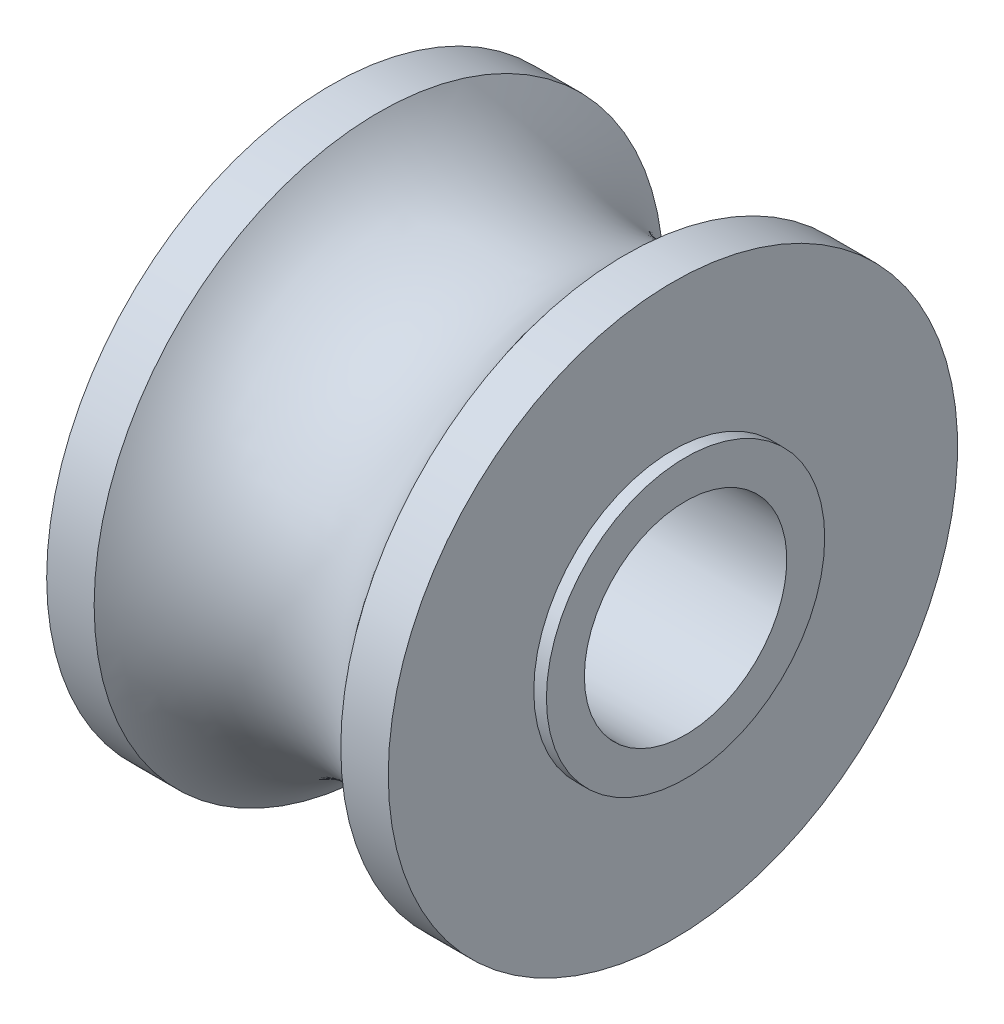
ISO-10303-21;
HEADER;
FILE_DESCRIPTION(('STEP AP214'),'2;1');
FILE_NAME('part.step','',(''),(''),'','','');
FILE_SCHEMA(('AUTOMOTIVE_DESIGN { 1 0 10303 214 1 1 1 1 }'));
ENDSEC;
DATA;
#1=APPLICATION_CONTEXT('core data for automotive mechanical design processes');
#2=APPLICATION_PROTOCOL_DEFINITION('international standard','automotive_design',2000,#1);
#3=PRODUCT_CONTEXT('',#1,'mechanical');
#4=PRODUCT('Part','Part','',(#3));
#5=PRODUCT_RELATED_PRODUCT_CATEGORY('part','',(#4));
#6=PRODUCT_DEFINITION_FORMATION('','',#4);
#7=PRODUCT_DEFINITION_CONTEXT('part definition',#1,'design');
#8=PRODUCT_DEFINITION('design','',#6,#7);
#9=PRODUCT_DEFINITION_SHAPE('','',#8);
#10=(LENGTH_UNIT() NAMED_UNIT(*) SI_UNIT(.MILLI.,.METRE.));
#11=(NAMED_UNIT(*) PLANE_ANGLE_UNIT() SI_UNIT($,.RADIAN.));
#12=(NAMED_UNIT(*) SI_UNIT($,.STERADIAN.) SOLID_ANGLE_UNIT());
#13=UNCERTAINTY_MEASURE_WITH_UNIT(LENGTH_MEASURE(1.E-05),#10,'distance_accuracy_value','');
#14=(GEOMETRIC_REPRESENTATION_CONTEXT(3) GLOBAL_UNCERTAINTY_ASSIGNED_CONTEXT((#13)) GLOBAL_UNIT_ASSIGNED_CONTEXT((#10,
#11,#12)) REPRESENTATION_CONTEXT('',''));
#15=CARTESIAN_POINT('',(0.,0.,0.));
#16=DIRECTION('',(0.,0.,1.));
#17=DIRECTION('',(1.,0.,0.));
#18=AXIS2_PLACEMENT_3D('',#15,#16,#17);
#19=CARTESIAN_POINT('',(0.,0.,0.));
#20=DIRECTION('',(-1.,0.,0.));
#21=DIRECTION('',(0.,0.,1.));
#22=AXIS2_PLACEMENT_3D('',#19,#20,#21);
#23=TOROIDAL_SURFACE('',#22,14.75,6.);
#24=CARTESIAN_POINT('',(4.87339717240448,0.,0.));
#25=DIRECTION('',(-1.,0.,0.));
#26=DIRECTION('',(0.,0.,1.));
#27=AXIS2_PLACEMENT_3D('',#24,#25,#26);
#28=CIRCLE('',#27,11.25);
#29=CARTESIAN_POINT('',(4.87339717240448,0.,11.25));
#30=VERTEX_POINT('',#29);
#31=EDGE_CURVE('E67',#30,#30,#28,.T.);
#32=ORIENTED_EDGE('',*,*,#31,.T.);
#33=EDGE_LOOP('',(#32));
#34=FACE_BOUND('',#33,.T.);
#35=CARTESIAN_POINT('',(-4.87339717240448,0.,0.));
#36=DIRECTION('',(-1.,0.,0.));
#37=DIRECTION('',(0.,0.,1.));
#38=AXIS2_PLACEMENT_3D('',#35,#36,#37);
#39=CIRCLE('',#38,11.25);
#40=CARTESIAN_POINT('',(-4.87339717240448,0.,11.25));
#41=VERTEX_POINT('',#40);
#42=EDGE_CURVE('E10',#41,#41,#39,.T.);
#43=ORIENTED_EDGE('',*,*,#42,.F.);
#44=EDGE_LOOP('',(#43));
#45=FACE_BOUND('',#44,.T.);
#46=ADVANCED_FACE('F33',(#34,#45),#23,.F.);
#47=CARTESIAN_POINT('',(-7.25,0.,0.));
#48=DIRECTION('',(-1.,0.,0.));
#49=DIRECTION('',(0.,0.,1.));
#50=AXIS2_PLACEMENT_3D('',#47,#48,#49);
#51=CYLINDRICAL_SURFACE('',#50,11.25);
#52=ORIENTED_EDGE('',*,*,#42,.T.);
#53=EDGE_LOOP('',(#52));
#54=FACE_BOUND('',#53,.T.);
#55=CARTESIAN_POINT('',(-6.75,0.,0.));
#56=DIRECTION('',(-1.,0.,0.));
#57=DIRECTION('',(0.,0.,1.));
#58=AXIS2_PLACEMENT_3D('',#55,#56,#57);
#59=CIRCLE('',#58,11.25);
#60=CARTESIAN_POINT('',(-6.75,0.,11.25));
#61=VERTEX_POINT('',#60);
#62=EDGE_CURVE('E39',#61,#61,#59,.T.);
#63=ORIENTED_EDGE('',*,*,#62,.F.);
#64=EDGE_LOOP('',(#63));
#65=FACE_BOUND('',#64,.T.);
#66=ADVANCED_FACE('F85',(#54,#65),#51,.T.);
#67=CARTESIAN_POINT('',(-6.75,0.,0.));
#68=DIRECTION('',(-1.,0.,0.));
#69=DIRECTION('',(0.,0.,1.));
#70=AXIS2_PLACEMENT_3D('',#67,#68,#69);
#71=PLANE('',#70);
#72=ORIENTED_EDGE('',*,*,#62,.T.);
#73=EDGE_LOOP('',(#72));
#74=FACE_BOUND('',#73,.T.);
#75=CARTESIAN_POINT('',(-6.75,0.,0.));
#76=DIRECTION('',(-1.,0.,0.));
#77=DIRECTION('',(0.,0.,1.));
#78=AXIS2_PLACEMENT_3D('',#75,#76,#77);
#79=CIRCLE('',#78,5.5);
#80=CARTESIAN_POINT('',(-6.75,0.,5.5));
#81=VERTEX_POINT('',#80);
#82=EDGE_CURVE('E43',#81,#81,#79,.T.);
#83=ORIENTED_EDGE('',*,*,#82,.F.);
#84=EDGE_LOOP('',(#83));
#85=FACE_BOUND('',#84,.T.);
#86=ADVANCED_FACE('F89',(#74,#85),#71,.T.);
#87=CARTESIAN_POINT('',(-7.25,0.,0.));
#88=DIRECTION('',(-1.,0.,0.));
#89=DIRECTION('',(0.,0.,1.));
#90=AXIS2_PLACEMENT_3D('',#87,#88,#89);
#91=CYLINDRICAL_SURFACE('',#90,5.5);
#92=ORIENTED_EDGE('',*,*,#82,.T.);
#93=EDGE_LOOP('',(#92));
#94=FACE_BOUND('',#93,.T.);
#95=CARTESIAN_POINT('',(-7.25,0.,0.));
#96=DIRECTION('',(-1.,0.,0.));
#97=DIRECTION('',(0.,0.,1.));
#98=AXIS2_PLACEMENT_3D('',#95,#96,#97);
#99=CIRCLE('',#98,5.5);
#100=CARTESIAN_POINT('',(-7.25,0.,5.5));
#101=VERTEX_POINT('',#100);
#102=EDGE_CURVE('E47',#101,#101,#99,.T.);
#103=ORIENTED_EDGE('',*,*,#102,.F.);
#104=EDGE_LOOP('',(#103));
#105=FACE_BOUND('',#104,.T.);
#106=ADVANCED_FACE('F93',(#94,#105),#91,.T.);
#107=CARTESIAN_POINT('',(-7.25,0.,0.));
#108=DIRECTION('',(-1.,0.,0.));
#109=DIRECTION('',(0.,0.,1.));
#110=AXIS2_PLACEMENT_3D('',#107,#108,#109);
#111=PLANE('',#110);
#112=ORIENTED_EDGE('',*,*,#102,.T.);
#113=EDGE_LOOP('',(#112));
#114=FACE_BOUND('',#113,.T.);
#115=CARTESIAN_POINT('',(-7.25,0.,0.));
#116=DIRECTION('',(-1.,0.,0.));
#117=DIRECTION('',(0.,0.,1.));
#118=AXIS2_PLACEMENT_3D('',#115,#116,#117);
#119=CIRCLE('',#118,4.);
#120=CARTESIAN_POINT('',(-7.25,0.,4.));
#121=VERTEX_POINT('',#120);
#122=EDGE_CURVE('E52',#121,#121,#119,.T.);
#123=ORIENTED_EDGE('',*,*,#122,.F.);
#124=EDGE_LOOP('',(#123));
#125=FACE_BOUND('',#124,.T.);
#126=ADVANCED_FACE('F99',(#114,#125),#111,.T.);
#127=CARTESIAN_POINT('',(-7.25,0.,0.));
#128=DIRECTION('',(-1.,0.,0.));
#129=DIRECTION('',(0.,0.,1.));
#130=AXIS2_PLACEMENT_3D('',#127,#128,#129);
#131=CYLINDRICAL_SURFACE('',#130,4.);
#132=CARTESIAN_POINT('',(7.25,0.,0.));
#133=DIRECTION('',(-1.,0.,0.));
#134=DIRECTION('',(0.,0.,1.));
#135=AXIS2_PLACEMENT_3D('',#132,#133,#134);
#136=CIRCLE('',#135,4.);
#137=CARTESIAN_POINT('',(7.25,0.,4.));
#138=VERTEX_POINT('',#137);
#139=EDGE_CURVE('E55',#138,#138,#136,.T.);
#140=ORIENTED_EDGE('',*,*,#139,.F.);
#141=EDGE_LOOP('',(#140));
#142=FACE_BOUND('',#141,.T.);
#143=ORIENTED_EDGE('',*,*,#122,.T.);
#144=EDGE_LOOP('',(#143));
#145=FACE_BOUND('',#144,.T.);
#146=ADVANCED_FACE('F103',(#142,#145),#131,.F.);
#147=CARTESIAN_POINT('',(7.25,0.,0.));
#148=DIRECTION('',(-1.,0.,0.));
#149=DIRECTION('',(0.,0.,1.));
#150=AXIS2_PLACEMENT_3D('',#147,#148,#149);
#151=PLANE('',#150);
#152=CARTESIAN_POINT('',(7.25,0.,0.));
#153=DIRECTION('',(-1.,0.,0.));
#154=DIRECTION('',(0.,0.,1.));
#155=AXIS2_PLACEMENT_3D('',#152,#153,#154);
#156=CIRCLE('',#155,5.5);
#157=CARTESIAN_POINT('',(7.25,0.,5.5));
#158=VERTEX_POINT('',#157);
#159=EDGE_CURVE('E58',#158,#158,#156,.T.);
#160=ORIENTED_EDGE('',*,*,#159,.F.);
#161=EDGE_LOOP('',(#160));
#162=FACE_BOUND('',#161,.T.);
#163=ORIENTED_EDGE('',*,*,#139,.T.);
#164=EDGE_LOOP('',(#163));
#165=FACE_BOUND('',#164,.T.);
#166=ADVANCED_FACE('F107',(#162,#165),#151,.F.);
#167=CARTESIAN_POINT('',(-7.25,0.,0.));
#168=DIRECTION('',(-1.,0.,0.));
#169=DIRECTION('',(0.,0.,1.));
#170=AXIS2_PLACEMENT_3D('',#167,#168,#169);
#171=CYLINDRICAL_SURFACE('',#170,5.5);
#172=CARTESIAN_POINT('',(6.75,0.,0.));
#173=DIRECTION('',(-1.,0.,0.));
#174=DIRECTION('',(0.,0.,1.));
#175=AXIS2_PLACEMENT_3D('',#172,#173,#174);
#176=CIRCLE('',#175,5.5);
#177=CARTESIAN_POINT('',(6.75,0.,5.5));
#178=VERTEX_POINT('',#177);
#179=EDGE_CURVE('E61',#178,#178,#176,.T.);
#180=ORIENTED_EDGE('',*,*,#179,.F.);
#181=EDGE_LOOP('',(#180));
#182=FACE_BOUND('',#181,.T.);
#183=ORIENTED_EDGE('',*,*,#159,.T.);
#184=EDGE_LOOP('',(#183));
#185=FACE_BOUND('',#184,.T.);
#186=ADVANCED_FACE('F81',(#182,#185),#171,.T.);
#187=CARTESIAN_POINT('',(6.75,0.,0.));
#188=DIRECTION('',(-1.,0.,0.));
#189=DIRECTION('',(0.,0.,1.));
#190=AXIS2_PLACEMENT_3D('',#187,#188,#189);
#191=PLANE('',#190);
#192=CARTESIAN_POINT('',(6.75,0.,0.));
#193=DIRECTION('',(-1.,0.,0.));
#194=DIRECTION('',(0.,0.,1.));
#195=AXIS2_PLACEMENT_3D('',#192,#193,#194);
#196=CIRCLE('',#195,11.25);
#197=CARTESIAN_POINT('',(6.75,0.,11.25));
#198=VERTEX_POINT('',#197);
#199=EDGE_CURVE('E64',#198,#198,#196,.T.);
#200=ORIENTED_EDGE('',*,*,#199,.F.);
#201=EDGE_LOOP('',(#200));
#202=FACE_BOUND('',#201,.T.);
#203=ORIENTED_EDGE('',*,*,#179,.T.);
#204=EDGE_LOOP('',(#203));
#205=FACE_BOUND('',#204,.T.);
#206=ADVANCED_FACE('F75',(#202,#205),#191,.F.);
#207=CARTESIAN_POINT('',(-7.25,0.,0.));
#208=DIRECTION('',(-1.,0.,0.));
#209=DIRECTION('',(0.,0.,1.));
#210=AXIS2_PLACEMENT_3D('',#207,#208,#209);
#211=CYLINDRICAL_SURFACE('',#210,11.25);
#212=ORIENTED_EDGE('',*,*,#199,.T.);
#213=EDGE_LOOP('',(#212));
#214=FACE_BOUND('',#213,.T.);
#215=ORIENTED_EDGE('',*,*,#31,.F.);
#216=EDGE_LOOP('',(#215));
#217=FACE_BOUND('',#216,.T.);
#218=ADVANCED_FACE('F73',(#214,#217),#211,.T.);
#219=CLOSED_SHELL('',(#46,#66,#86,#106,#126,#146,#166,#186,#206,#218));
#220=MANIFOLD_SOLID_BREP('B2',#219);
#221=ADVANCED_BREP_SHAPE_REPRESENTATION('',(#18,#220),#14);
#222=SHAPE_DEFINITION_REPRESENTATION(#9,#221);
ENDSEC;
END-ISO-10303-21;
